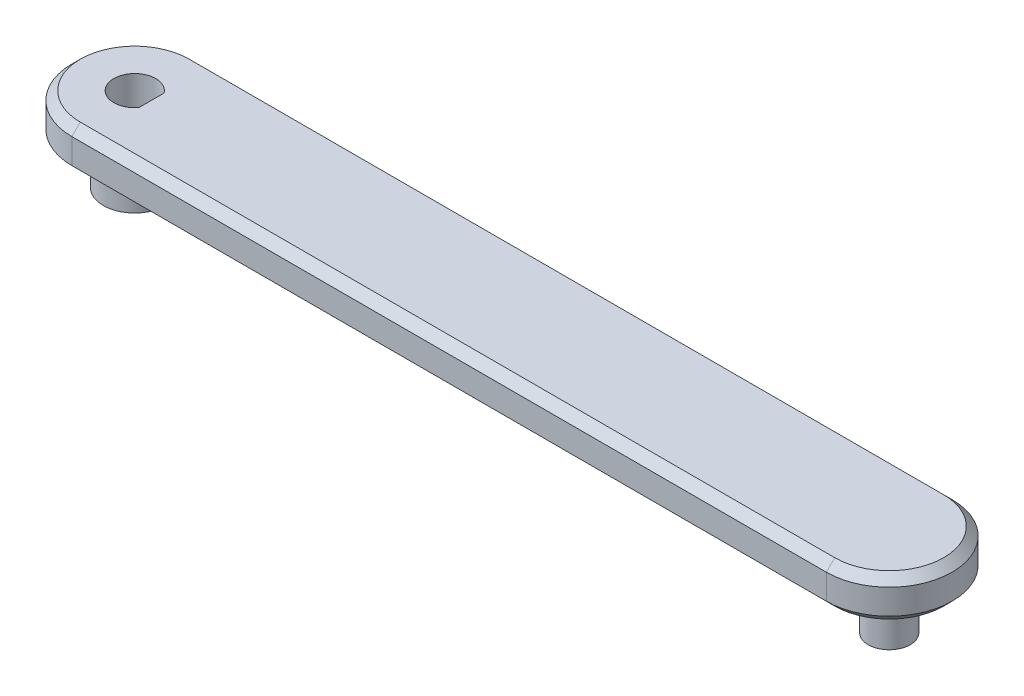
ISO-10303-21;
HEADER;
FILE_DESCRIPTION(('STEP AP214'),'2;1');
FILE_NAME('part.step','',(''),(''),'','','');
FILE_SCHEMA(('AUTOMOTIVE_DESIGN { 1 0 10303 214 1 1 1 1 }'));
ENDSEC;
DATA;
#1=APPLICATION_CONTEXT('core data for automotive mechanical design processes');
#2=APPLICATION_PROTOCOL_DEFINITION('international standard','automotive_design',2000,#1);
#3=PRODUCT_CONTEXT('',#1,'mechanical');
#4=PRODUCT('Part','Part','',(#3));
#5=PRODUCT_RELATED_PRODUCT_CATEGORY('part','',(#4));
#6=PRODUCT_DEFINITION_FORMATION('','',#4);
#7=PRODUCT_DEFINITION_CONTEXT('part definition',#1,'design');
#8=PRODUCT_DEFINITION('design','',#6,#7);
#9=PRODUCT_DEFINITION_SHAPE('','',#8);
#10=(LENGTH_UNIT() NAMED_UNIT(*) SI_UNIT(.MILLI.,.METRE.));
#11=(NAMED_UNIT(*) PLANE_ANGLE_UNIT() SI_UNIT($,.RADIAN.));
#12=(NAMED_UNIT(*) SI_UNIT($,.STERADIAN.) SOLID_ANGLE_UNIT());
#13=UNCERTAINTY_MEASURE_WITH_UNIT(LENGTH_MEASURE(1.E-05),#10,'distance_accuracy_value','');
#14=(GEOMETRIC_REPRESENTATION_CONTEXT(3) GLOBAL_UNCERTAINTY_ASSIGNED_CONTEXT((#13)) GLOBAL_UNIT_ASSIGNED_CONTEXT((#10,
#11,#12)) REPRESENTATION_CONTEXT('',''));
#15=CARTESIAN_POINT('',(0.,0.,0.));
#16=DIRECTION('',(0.,0.,1.));
#17=DIRECTION('',(1.,0.,0.));
#18=AXIS2_PLACEMENT_3D('',#15,#16,#17);
#19=CARTESIAN_POINT('',(180.,10.,0.));
#20=DIRECTION('',(0.,1.,0.));
#21=DIRECTION('',(0.,0.,1.));
#22=AXIS2_PLACEMENT_3D('',#19,#20,#21);
#23=PLANE('',#22);
#24=DIRECTION('',(-1.,0.,0.));
#25=VECTOR('',#24,1.);
#26=CARTESIAN_POINT('',(180.,10.,-13.0000000000001));
#27=LINE('',#26,#25);
#28=CARTESIAN_POINT('',(180.,10.,-13.0000000000001));
#29=VERTEX_POINT('',#28);
#30=CARTESIAN_POINT('',(0.,10.,-13.0000000000001));
#31=VERTEX_POINT('',#30);
#32=EDGE_CURVE('E152',#29,#31,#27,.T.);
#33=ORIENTED_EDGE('',*,*,#32,.T.);
#34=CARTESIAN_POINT('',(0.,10.,0.));
#35=DIRECTION('',(0.,1.,0.));
#36=DIRECTION('',(0.,0.,1.));
#37=AXIS2_PLACEMENT_3D('',#34,#35,#36);
#38=CIRCLE('',#37,13.0000000000001);
#39=CARTESIAN_POINT('',(0.,10.,13.0000000000001));
#40=VERTEX_POINT('',#39);
#41=EDGE_CURVE('E156',#31,#40,#38,.T.);
#42=ORIENTED_EDGE('',*,*,#41,.T.);
#43=DIRECTION('',(1.,0.,0.));
#44=VECTOR('',#43,1.);
#45=CARTESIAN_POINT('',(180.,10.,13.0000000000001));
#46=LINE('',#45,#44);
#47=CARTESIAN_POINT('',(180.,10.,13.0000000000001));
#48=VERTEX_POINT('',#47);
#49=EDGE_CURVE('E154',#40,#48,#46,.T.);
#50=ORIENTED_EDGE('',*,*,#49,.T.);
#51=CARTESIAN_POINT('',(180.,10.,0.));
#52=DIRECTION('',(0.,1.,0.));
#53=DIRECTION('',(0.,0.,1.));
#54=AXIS2_PLACEMENT_3D('',#51,#52,#53);
#55=CIRCLE('',#54,13.0000000000001);
#56=EDGE_CURVE('E150',#48,#29,#55,.T.);
#57=ORIENTED_EDGE('',*,*,#56,.T.);
#58=EDGE_LOOP('',(#33,#42,#50,#57));
#59=FACE_BOUND('',#58,.T.);
#60=DIRECTION('',(0.,0.,-1.));
#61=VECTOR('',#60,1.);
#62=CARTESIAN_POINT('',(4.,10.,3.));
#63=LINE('',#62,#61);
#64=CARTESIAN_POINT('',(4.,10.,3.));
#65=VERTEX_POINT('',#64);
#66=CARTESIAN_POINT('',(4.,10.,-3.));
#67=VERTEX_POINT('',#66);
#68=EDGE_CURVE('E121',#65,#67,#63,.T.);
#69=ORIENTED_EDGE('',*,*,#68,.F.);
#70=CARTESIAN_POINT('',(0.,10.,0.));
#71=DIRECTION('',(0.,-1.,0.));
#72=DIRECTION('',(0.,0.,-1.));
#73=AXIS2_PLACEMENT_3D('',#70,#71,#72);
#74=CIRCLE('',#73,5.);
#75=EDGE_CURVE('E53',#65,#67,#74,.T.);
#76=ORIENTED_EDGE('',*,*,#75,.T.);
#77=EDGE_LOOP('',(#69,#76));
#78=FACE_BOUND('',#77,.T.);
#79=ADVANCED_FACE('F37',(#59,#78),#23,.T.);
#80=CARTESIAN_POINT('',(0.,-10.,0.));
#81=DIRECTION('',(0.,-1.,0.));
#82=DIRECTION('',(0.,0.,-1.));
#83=AXIS2_PLACEMENT_3D('',#80,#81,#82);
#84=PLANE('',#83);
#85=CARTESIAN_POINT('',(0.,-10.,0.));
#86=DIRECTION('',(0.,-1.,0.));
#87=DIRECTION('',(0.,0.,-1.));
#88=AXIS2_PLACEMENT_3D('',#85,#86,#87);
#89=CIRCLE('',#88,7.5);
#90=CARTESIAN_POINT('',(0.,-10.,-7.5));
#91=VERTEX_POINT('',#90);
#92=EDGE_CURVE('E117',#91,#91,#89,.T.);
#93=ORIENTED_EDGE('',*,*,#92,.T.);
#94=EDGE_LOOP('',(#93));
#95=FACE_BOUND('',#94,.T.);
#96=DIRECTION('',(0.,0.,-1.));
#97=VECTOR('',#96,1.);
#98=CARTESIAN_POINT('',(4.,-10.,3.));
#99=LINE('',#98,#97);
#100=CARTESIAN_POINT('',(4.,-10.,3.));
#101=VERTEX_POINT('',#100);
#102=CARTESIAN_POINT('',(4.,-10.,-3.));
#103=VERTEX_POINT('',#102);
#104=EDGE_CURVE('E131',#101,#103,#99,.T.);
#105=ORIENTED_EDGE('',*,*,#104,.T.);
#106=CARTESIAN_POINT('',(0.,-10.,0.));
#107=DIRECTION('',(0.,-1.,0.));
#108=DIRECTION('',(0.,0.,-1.));
#109=AXIS2_PLACEMENT_3D('',#106,#107,#108);
#110=CIRCLE('',#109,5.);
#111=EDGE_CURVE('E115',#101,#103,#110,.T.);
#112=ORIENTED_EDGE('',*,*,#111,.F.);
#113=EDGE_LOOP('',(#105,#112));
#114=FACE_BOUND('',#113,.T.);
#115=ADVANCED_FACE('F272',(#95,#114),#84,.T.);
#116=CARTESIAN_POINT('',(0.,10.,15.));
#117=DIRECTION('',(0.,0.,-1.));
#118=DIRECTION('',(-1.,0.,0.));
#119=AXIS2_PLACEMENT_3D('',#116,#117,#118);
#120=PLANE('',#119);
#121=DIRECTION('',(0.,-1.,0.));
#122=VECTOR('',#121,1.);
#123=CARTESIAN_POINT('',(180.,10.,15.));
#124=LINE('',#123,#122);
#125=CARTESIAN_POINT('',(180.,8.00000000000007,15.));
#126=VERTEX_POINT('',#125);
#127=CARTESIAN_POINT('',(180.,2.,15.));
#128=VERTEX_POINT('',#127);
#129=EDGE_CURVE('E147',#126,#128,#124,.T.);
#130=ORIENTED_EDGE('',*,*,#129,.F.);
#131=DIRECTION('',(-1.,0.,0.));
#132=VECTOR('',#131,1.);
#133=CARTESIAN_POINT('',(0.,8.00000000000007,15.));
#134=LINE('',#133,#132);
#135=CARTESIAN_POINT('',(0.,8.00000000000007,15.));
#136=VERTEX_POINT('',#135);
#137=EDGE_CURVE('E166',#126,#136,#134,.T.);
#138=ORIENTED_EDGE('',*,*,#137,.T.);
#139=DIRECTION('',(0.,-1.,0.));
#140=VECTOR('',#139,1.);
#141=CARTESIAN_POINT('',(0.,10.,15.));
#142=LINE('',#141,#140);
#143=CARTESIAN_POINT('',(0.,2.,15.));
#144=VERTEX_POINT('',#143);
#145=EDGE_CURVE('E137',#136,#144,#142,.T.);
#146=ORIENTED_EDGE('',*,*,#145,.T.);
#147=DIRECTION('',(1.,0.,0.));
#148=VECTOR('',#147,1.);
#149=CARTESIAN_POINT('',(0.,2.,15.));
#150=LINE('',#149,#148);
#151=EDGE_CURVE('E164',#144,#128,#150,.T.);
#152=ORIENTED_EDGE('',*,*,#151,.T.);
#153=EDGE_LOOP('',(#130,#138,#146,#152));
#154=FACE_BOUND('',#153,.T.);
#155=ADVANCED_FACE('F259',(#154),#120,.F.);
#156=CARTESIAN_POINT('',(180.,10.,0.));
#157=DIRECTION('',(0.,-1.,0.));
#158=DIRECTION('',(0.,0.,-1.));
#159=AXIS2_PLACEMENT_3D('',#156,#157,#158);
#160=CYLINDRICAL_SURFACE('',#159,15.);
#161=DIRECTION('',(0.,-1.,0.));
#162=VECTOR('',#161,1.);
#163=CARTESIAN_POINT('',(180.,10.,-15.));
#164=LINE('',#163,#162);
#165=CARTESIAN_POINT('',(180.,8.00000000000007,-15.));
#166=VERTEX_POINT('',#165);
#167=CARTESIAN_POINT('',(180.,2.,-15.));
#168=VERTEX_POINT('',#167);
#169=EDGE_CURVE('E144',#166,#168,#164,.T.);
#170=ORIENTED_EDGE('',*,*,#169,.F.);
#171=CARTESIAN_POINT('',(180.,8.00000000000007,0.));
#172=DIRECTION('',(0.,1.,0.));
#173=DIRECTION('',(0.,0.,1.));
#174=AXIS2_PLACEMENT_3D('',#171,#172,#173);
#175=CIRCLE('',#174,15.);
#176=EDGE_CURVE('E175',#166,#126,#175,.F.);
#177=ORIENTED_EDGE('',*,*,#176,.T.);
#178=ORIENTED_EDGE('',*,*,#129,.T.);
#179=CARTESIAN_POINT('',(180.,2.,0.));
#180=DIRECTION('',(0.,1.,0.));
#181=DIRECTION('',(0.,0.,1.));
#182=AXIS2_PLACEMENT_3D('',#179,#180,#181);
#183=CIRCLE('',#182,15.);
#184=EDGE_CURVE('E172',#128,#168,#183,.T.);
#185=ORIENTED_EDGE('',*,*,#184,.T.);
#186=EDGE_LOOP('',(#170,#177,#178,#185));
#187=FACE_BOUND('',#186,.T.);
#188=ADVANCED_FACE('F232',(#187),#160,.T.);
#189=CARTESIAN_POINT('',(0.,10.,-15.));
#190=DIRECTION('',(0.,0.,-1.));
#191=DIRECTION('',(-1.,0.,0.));
#192=AXIS2_PLACEMENT_3D('',#189,#190,#191);
#193=PLANE('',#192);
#194=DIRECTION('',(0.,-1.,0.));
#195=VECTOR('',#194,1.);
#196=CARTESIAN_POINT('',(0.,10.,-15.));
#197=LINE('',#196,#195);
#198=CARTESIAN_POINT('',(0.,8.00000000000007,-15.));
#199=VERTEX_POINT('',#198);
#200=CARTESIAN_POINT('',(0.,2.,-15.));
#201=VERTEX_POINT('',#200);
#202=EDGE_CURVE('E140',#199,#201,#197,.T.);
#203=ORIENTED_EDGE('',*,*,#202,.F.);
#204=DIRECTION('',(1.,0.,0.));
#205=VECTOR('',#204,1.);
#206=CARTESIAN_POINT('',(0.,8.00000000000007,-15.));
#207=LINE('',#206,#205);
#208=EDGE_CURVE('E170',#199,#166,#207,.T.);
#209=ORIENTED_EDGE('',*,*,#208,.T.);
#210=ORIENTED_EDGE('',*,*,#169,.T.);
#211=DIRECTION('',(-1.,0.,0.));
#212=VECTOR('',#211,1.);
#213=CARTESIAN_POINT('',(0.,2.,-15.));
#214=LINE('',#213,#212);
#215=EDGE_CURVE('E168',#168,#201,#214,.T.);
#216=ORIENTED_EDGE('',*,*,#215,.T.);
#217=EDGE_LOOP('',(#203,#209,#210,#216));
#218=FACE_BOUND('',#217,.T.);
#219=ADVANCED_FACE('F235',(#218),#193,.T.);
#220=CARTESIAN_POINT('',(0.,10.,0.));
#221=DIRECTION('',(0.,-1.,0.));
#222=DIRECTION('',(0.,0.,-1.));
#223=AXIS2_PLACEMENT_3D('',#220,#221,#222);
#224=CYLINDRICAL_SURFACE('',#223,15.);
#225=ORIENTED_EDGE('',*,*,#145,.F.);
#226=CARTESIAN_POINT('',(0.,8.00000000000007,0.));
#227=DIRECTION('',(0.,1.,0.));
#228=DIRECTION('',(0.,0.,1.));
#229=AXIS2_PLACEMENT_3D('',#226,#227,#228);
#230=CIRCLE('',#229,15.);
#231=EDGE_CURVE('E161',#136,#199,#230,.F.);
#232=ORIENTED_EDGE('',*,*,#231,.T.);
#233=ORIENTED_EDGE('',*,*,#202,.T.);
#234=CARTESIAN_POINT('',(0.,2.,0.));
#235=DIRECTION('',(0.,1.,0.));
#236=DIRECTION('',(0.,0.,1.));
#237=AXIS2_PLACEMENT_3D('',#234,#235,#236);
#238=CIRCLE('',#237,15.);
#239=EDGE_CURVE('E159',#201,#144,#238,.T.);
#240=ORIENTED_EDGE('',*,*,#239,.T.);
#241=EDGE_LOOP('',(#225,#232,#233,#240));
#242=FACE_BOUND('',#241,.T.);
#243=ADVANCED_FACE('F212',(#242),#224,.T.);
#244=CARTESIAN_POINT('',(180.,0.,0.));
#245=DIRECTION('',(0.,1.,0.));
#246=DIRECTION('',(0.,0.,1.));
#247=AXIS2_PLACEMENT_3D('',#244,#245,#246);
#248=PLANE('',#247);
#249=CARTESIAN_POINT('',(180.,0.,0.));
#250=DIRECTION('',(0.,1.,0.));
#251=DIRECTION('',(0.,0.,1.));
#252=AXIS2_PLACEMENT_3D('',#249,#250,#251);
#253=CIRCLE('',#252,4.99999999999999);
#254=CARTESIAN_POINT('',(180.,0.,4.99999999999999));
#255=VERTEX_POINT('',#254);
#256=EDGE_CURVE('E11',#255,#255,#253,.F.);
#257=ORIENTED_EDGE('',*,*,#256,.F.);
#258=EDGE_LOOP('',(#257));
#259=FACE_BOUND('',#258,.T.);
#260=CARTESIAN_POINT('',(0.,0.,0.));
#261=DIRECTION('',(0.,1.,0.));
#262=DIRECTION('',(0.,0.,1.));
#263=AXIS2_PLACEMENT_3D('',#260,#261,#262);
#264=CIRCLE('',#263,7.5);
#265=CARTESIAN_POINT('',(0.,0.,7.5));
#266=VERTEX_POINT('',#265);
#267=EDGE_CURVE('E46',#266,#266,#264,.F.);
#268=ORIENTED_EDGE('',*,*,#267,.F.);
#269=EDGE_LOOP('',(#268));
#270=FACE_BOUND('',#269,.T.);
#271=DIRECTION('',(1.,0.,0.));
#272=VECTOR('',#271,1.);
#273=CARTESIAN_POINT('',(180.,0.,-13.));
#274=LINE('',#273,#272);
#275=CARTESIAN_POINT('',(0.,0.,-13.));
#276=VERTEX_POINT('',#275);
#277=CARTESIAN_POINT('',(180.,0.,-13.));
#278=VERTEX_POINT('',#277);
#279=EDGE_CURVE('E177',#276,#278,#274,.T.);
#280=ORIENTED_EDGE('',*,*,#279,.T.);
#281=CARTESIAN_POINT('',(180.,0.,0.));
#282=DIRECTION('',(0.,1.,0.));
#283=DIRECTION('',(0.,0.,1.));
#284=AXIS2_PLACEMENT_3D('',#281,#282,#283);
#285=CIRCLE('',#284,13.);
#286=CARTESIAN_POINT('',(180.,0.,13.));
#287=VERTEX_POINT('',#286);
#288=EDGE_CURVE('E183',#278,#287,#285,.F.);
#289=ORIENTED_EDGE('',*,*,#288,.T.);
#290=DIRECTION('',(-1.,0.,0.));
#291=VECTOR('',#290,1.);
#292=CARTESIAN_POINT('',(180.,0.,13.));
#293=LINE('',#292,#291);
#294=CARTESIAN_POINT('',(0.,0.,13.));
#295=VERTEX_POINT('',#294);
#296=EDGE_CURVE('E181',#287,#295,#293,.T.);
#297=ORIENTED_EDGE('',*,*,#296,.T.);
#298=CARTESIAN_POINT('',(0.,0.,0.));
#299=DIRECTION('',(0.,1.,0.));
#300=DIRECTION('',(0.,0.,1.));
#301=AXIS2_PLACEMENT_3D('',#298,#299,#300);
#302=CIRCLE('',#301,13.);
#303=EDGE_CURVE('E179',#295,#276,#302,.F.);
#304=ORIENTED_EDGE('',*,*,#303,.T.);
#305=EDGE_LOOP('',(#280,#289,#297,#304));
#306=FACE_BOUND('',#305,.T.);
#307=ADVANCED_FACE('F208',(#259,#270,#306),#248,.F.);
#308=CARTESIAN_POINT('',(180.,10.,0.));
#309=DIRECTION('',(0.,-1.,0.));
#310=DIRECTION('',(0.,0.,-1.));
#311=AXIS2_PLACEMENT_3D('',#308,#309,#310);
#312=CONICAL_SURFACE('',#311,13.0000000000001,0.785398163397445);
#313=DIRECTION('',(0.,0.70710678118655,-0.707106781186545));
#314=VECTOR('',#313,1.);
#315=CARTESIAN_POINT('',(180.,8.00000000000007,15.));
#316=LINE('',#315,#314);
#317=EDGE_CURVE('E191',#126,#48,#316,.T.);
#318=ORIENTED_EDGE('',*,*,#317,.F.);
#319=ORIENTED_EDGE('',*,*,#176,.F.);
#320=DIRECTION('',(0.,-0.70710678118655,-0.707106781186545));
#321=VECTOR('',#320,1.);
#322=CARTESIAN_POINT('',(180.,10.,-13.0000000000001));
#323=LINE('',#322,#321);
#324=EDGE_CURVE('E141',#29,#166,#323,.T.);
#325=ORIENTED_EDGE('',*,*,#324,.F.);
#326=ORIENTED_EDGE('',*,*,#56,.F.);
#327=EDGE_LOOP('',(#318,#319,#325,#326));
#328=FACE_BOUND('',#327,.T.);
#329=ADVANCED_FACE('F211',(#328),#312,.T.);
#330=CARTESIAN_POINT('',(0.,8.00000000000007,-15.));
#331=DIRECTION('',(0.,-0.707106781186545,0.70710678118655));
#332=DIRECTION('',(1.,0.,0.));
#333=AXIS2_PLACEMENT_3D('',#330,#331,#332);
#334=PLANE('',#333);
#335=ORIENTED_EDGE('',*,*,#324,.T.);
#336=ORIENTED_EDGE('',*,*,#208,.F.);
#337=DIRECTION('',(0.,-0.70710678118655,-0.707106781186545));
#338=VECTOR('',#337,1.);
#339=CARTESIAN_POINT('',(0.,10.,-13.0000000000001));
#340=LINE('',#339,#338);
#341=EDGE_CURVE('E188',#31,#199,#340,.T.);
#342=ORIENTED_EDGE('',*,*,#341,.F.);
#343=ORIENTED_EDGE('',*,*,#32,.F.);
#344=EDGE_LOOP('',(#335,#336,#342,#343));
#345=FACE_BOUND('',#344,.T.);
#346=ADVANCED_FACE('F239',(#345),#334,.F.);
#347=CARTESIAN_POINT('',(180.,10.,13.0000000000001));
#348=DIRECTION('',(0.,0.707106781186545,0.70710678118655));
#349=DIRECTION('',(-1.,0.,0.));
#350=AXIS2_PLACEMENT_3D('',#347,#348,#349);
#351=PLANE('',#350);
#352=ORIENTED_EDGE('',*,*,#317,.T.);
#353=ORIENTED_EDGE('',*,*,#49,.F.);
#354=DIRECTION('',(0.,0.70710678118655,-0.707106781186545));
#355=VECTOR('',#354,1.);
#356=CARTESIAN_POINT('',(0.,8.00000000000007,15.));
#357=LINE('',#356,#355);
#358=EDGE_CURVE('E186',#136,#40,#357,.T.);
#359=ORIENTED_EDGE('',*,*,#358,.F.);
#360=ORIENTED_EDGE('',*,*,#137,.F.);
#361=EDGE_LOOP('',(#352,#353,#359,#360));
#362=FACE_BOUND('',#361,.T.);
#363=ADVANCED_FACE('F253',(#362),#351,.T.);
#364=CARTESIAN_POINT('',(0.,10.,0.));
#365=DIRECTION('',(0.,-1.,0.));
#366=DIRECTION('',(0.,0.,-1.));
#367=AXIS2_PLACEMENT_3D('',#364,#365,#366);
#368=CONICAL_SURFACE('',#367,13.0000000000001,0.785398163397445);
#369=ORIENTED_EDGE('',*,*,#341,.T.);
#370=ORIENTED_EDGE('',*,*,#231,.F.);
#371=ORIENTED_EDGE('',*,*,#358,.T.);
#372=ORIENTED_EDGE('',*,*,#41,.F.);
#373=EDGE_LOOP('',(#369,#370,#371,#372));
#374=FACE_BOUND('',#373,.T.);
#375=ADVANCED_FACE('F249',(#374),#368,.T.);
#376=CARTESIAN_POINT('',(0.,2.,0.));
#377=DIRECTION('',(0.,1.,0.));
#378=DIRECTION('',(0.,0.,1.));
#379=AXIS2_PLACEMENT_3D('',#376,#377,#378);
#380=CONICAL_SURFACE('',#379,15.,0.785398163397448);
#381=DIRECTION('',(0.,0.707106781186547,-0.707106781186547));
#382=VECTOR('',#381,1.);
#383=CARTESIAN_POINT('',(0.,0.,-13.));
#384=LINE('',#383,#382);
#385=EDGE_CURVE('E199',#276,#201,#384,.T.);
#386=ORIENTED_EDGE('',*,*,#385,.F.);
#387=ORIENTED_EDGE('',*,*,#303,.F.);
#388=DIRECTION('',(0.,-0.707106781186547,-0.707106781186547));
#389=VECTOR('',#388,1.);
#390=CARTESIAN_POINT('',(0.,2.,15.));
#391=LINE('',#390,#389);
#392=EDGE_CURVE('E189',#144,#295,#391,.T.);
#393=ORIENTED_EDGE('',*,*,#392,.F.);
#394=ORIENTED_EDGE('',*,*,#239,.F.);
#395=EDGE_LOOP('',(#386,#387,#393,#394));
#396=FACE_BOUND('',#395,.T.);
#397=ADVANCED_FACE('F40',(#396),#380,.T.);
#398=CARTESIAN_POINT('',(0.,2.,15.));
#399=DIRECTION('',(0.,0.707106781186547,-0.707106781186547));
#400=DIRECTION('',(1.,0.,0.));
#401=AXIS2_PLACEMENT_3D('',#398,#399,#400);
#402=PLANE('',#401);
#403=ORIENTED_EDGE('',*,*,#392,.T.);
#404=ORIENTED_EDGE('',*,*,#296,.F.);
#405=DIRECTION('',(0.,-0.707106781186547,-0.707106781186547));
#406=VECTOR('',#405,1.);
#407=CARTESIAN_POINT('',(180.,2.,15.));
#408=LINE('',#407,#406);
#409=EDGE_CURVE('E197',#128,#287,#408,.T.);
#410=ORIENTED_EDGE('',*,*,#409,.F.);
#411=ORIENTED_EDGE('',*,*,#151,.F.);
#412=EDGE_LOOP('',(#403,#404,#410,#411));
#413=FACE_BOUND('',#412,.T.);
#414=ADVANCED_FACE('F263',(#413),#402,.F.);
#415=CARTESIAN_POINT('',(180.,0.,-13.));
#416=DIRECTION('',(0.,-0.707106781186547,-0.707106781186547));
#417=DIRECTION('',(-1.,0.,0.));
#418=AXIS2_PLACEMENT_3D('',#415,#416,#417);
#419=PLANE('',#418);
#420=ORIENTED_EDGE('',*,*,#385,.T.);
#421=ORIENTED_EDGE('',*,*,#215,.F.);
#422=DIRECTION('',(0.,0.707106781186547,-0.707106781186547));
#423=VECTOR('',#422,1.);
#424=CARTESIAN_POINT('',(180.,0.,-13.));
#425=LINE('',#424,#423);
#426=EDGE_CURVE('E136',#278,#168,#425,.T.);
#427=ORIENTED_EDGE('',*,*,#426,.F.);
#428=ORIENTED_EDGE('',*,*,#279,.F.);
#429=EDGE_LOOP('',(#420,#421,#427,#428));
#430=FACE_BOUND('',#429,.T.);
#431=ADVANCED_FACE('F227',(#430),#419,.T.);
#432=CARTESIAN_POINT('',(180.,2.,0.));
#433=DIRECTION('',(0.,1.,0.));
#434=DIRECTION('',(0.,0.,1.));
#435=AXIS2_PLACEMENT_3D('',#432,#433,#434);
#436=CONICAL_SURFACE('',#435,15.,0.785398163397448);
#437=ORIENTED_EDGE('',*,*,#409,.T.);
#438=ORIENTED_EDGE('',*,*,#288,.F.);
#439=ORIENTED_EDGE('',*,*,#426,.T.);
#440=ORIENTED_EDGE('',*,*,#184,.F.);
#441=EDGE_LOOP('',(#437,#438,#439,#440));
#442=FACE_BOUND('',#441,.T.);
#443=ADVANCED_FACE('F222',(#442),#436,.T.);
#444=CARTESIAN_POINT('',(0.,-10.,0.));
#445=DIRECTION('',(0.,1.,0.));
#446=DIRECTION('',(0.,0.,1.));
#447=AXIS2_PLACEMENT_3D('',#444,#445,#446);
#448=CYLINDRICAL_SURFACE('',#447,7.5);
#449=ORIENTED_EDGE('',*,*,#92,.F.);
#450=EDGE_LOOP('',(#449));
#451=FACE_BOUND('',#450,.T.);
#452=ORIENTED_EDGE('',*,*,#267,.T.);
#453=EDGE_LOOP('',(#452));
#454=FACE_BOUND('',#453,.T.);
#455=ADVANCED_FACE('F206',(#451,#454),#448,.T.);
#456=CARTESIAN_POINT('',(0.,-10.,0.));
#457=DIRECTION('',(0.,1.,0.));
#458=DIRECTION('',(0.,0.,1.));
#459=AXIS2_PLACEMENT_3D('',#456,#457,#458);
#460=CYLINDRICAL_SURFACE('',#459,5.);
#461=DIRECTION('',(0.,1.,0.));
#462=VECTOR('',#461,1.);
#463=CARTESIAN_POINT('',(4.,-10.,3.));
#464=LINE('',#463,#462);
#465=EDGE_CURVE('E118',#101,#65,#464,.T.);
#466=ORIENTED_EDGE('',*,*,#465,.F.);
#467=ORIENTED_EDGE('',*,*,#111,.T.);
#468=DIRECTION('',(0.,1.,0.));
#469=VECTOR('',#468,1.);
#470=CARTESIAN_POINT('',(4.,-10.,-3.));
#471=LINE('',#470,#469);
#472=EDGE_CURVE('E60',#103,#67,#471,.T.);
#473=ORIENTED_EDGE('',*,*,#472,.T.);
#474=ORIENTED_EDGE('',*,*,#75,.F.);
#475=EDGE_LOOP('',(#466,#467,#473,#474));
#476=FACE_BOUND('',#475,.T.);
#477=ADVANCED_FACE('F113',(#476),#460,.F.);
#478=CARTESIAN_POINT('',(4.,-10.,3.));
#479=DIRECTION('',(1.,0.,0.));
#480=DIRECTION('',(0.,0.,-1.));
#481=AXIS2_PLACEMENT_3D('',#478,#479,#480);
#482=PLANE('',#481);
#483=ORIENTED_EDGE('',*,*,#472,.F.);
#484=ORIENTED_EDGE('',*,*,#104,.F.);
#485=ORIENTED_EDGE('',*,*,#465,.T.);
#486=ORIENTED_EDGE('',*,*,#68,.T.);
#487=EDGE_LOOP('',(#483,#484,#485,#486));
#488=FACE_BOUND('',#487,.T.);
#489=ADVANCED_FACE('F122',(#488),#482,.F.);
#490=CARTESIAN_POINT('',(180.,-12.,0.));
#491=DIRECTION('',(0.,1.,0.));
#492=DIRECTION('',(0.,0.,1.));
#493=AXIS2_PLACEMENT_3D('',#490,#491,#492);
#494=CYLINDRICAL_SURFACE('',#493,4.99999999999999);
#495=CARTESIAN_POINT('',(180.,-12.,0.));
#496=DIRECTION('',(0.,-1.,0.));
#497=DIRECTION('',(0.,0.,-1.));
#498=AXIS2_PLACEMENT_3D('',#495,#496,#497);
#499=CIRCLE('',#498,4.99999999999999);
#500=CARTESIAN_POINT('',(180.,-12.,-4.99999999999999));
#501=VERTEX_POINT('',#500);
#502=EDGE_CURVE('E125',#501,#501,#499,.T.);
#503=ORIENTED_EDGE('',*,*,#502,.F.);
#504=EDGE_LOOP('',(#503));
#505=FACE_BOUND('',#504,.T.);
#506=ORIENTED_EDGE('',*,*,#256,.T.);
#507=EDGE_LOOP('',(#506));
#508=FACE_BOUND('',#507,.T.);
#509=ADVANCED_FACE('F348',(#505,#508),#494,.T.);
#510=CARTESIAN_POINT('',(180.,-12.,0.));
#511=DIRECTION('',(0.,-1.,0.));
#512=DIRECTION('',(0.,0.,-1.));
#513=AXIS2_PLACEMENT_3D('',#510,#511,#512);
#514=PLANE('',#513);
#515=ORIENTED_EDGE('',*,*,#502,.T.);
#516=EDGE_LOOP('',(#515));
#517=FACE_BOUND('',#516,.T.);
#518=ADVANCED_FACE('F355',(#517),#514,.T.);
#519=CLOSED_SHELL('',(#79,#115,#155,#188,#219,#243,#307,#329,#346,#363,#375,#397,#414,#431,#443,
#455,#477,#489,#509,#518));
#520=MANIFOLD_SOLID_BREP('B2',#519);
#521=ADVANCED_BREP_SHAPE_REPRESENTATION('',(#18,#520),#14);
#522=SHAPE_DEFINITION_REPRESENTATION(#9,#521);
ENDSEC;
END-ISO-10303-21;
